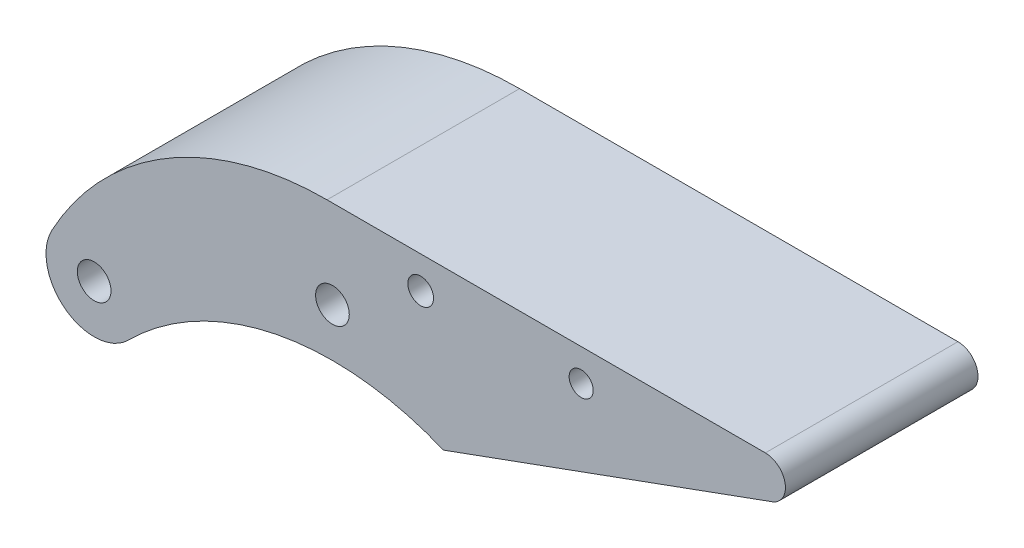
ISO-10303-21;
HEADER;
FILE_DESCRIPTION(('STEP AP214'),'2;1');
FILE_NAME('part.step','',(''),(''),'','','');
FILE_SCHEMA(('AUTOMOTIVE_DESIGN { 1 0 10303 214 1 1 1 1 }'));
ENDSEC;
DATA;
#1=APPLICATION_CONTEXT('core data for automotive mechanical design processes');
#2=APPLICATION_PROTOCOL_DEFINITION('international standard','automotive_design',2000,#1);
#3=PRODUCT_CONTEXT('',#1,'mechanical');
#4=PRODUCT('Part','Part','',(#3));
#5=PRODUCT_RELATED_PRODUCT_CATEGORY('part','',(#4));
#6=PRODUCT_DEFINITION_FORMATION('','',#4);
#7=PRODUCT_DEFINITION_CONTEXT('part definition',#1,'design');
#8=PRODUCT_DEFINITION('design','',#6,#7);
#9=PRODUCT_DEFINITION_SHAPE('','',#8);
#10=(LENGTH_UNIT() NAMED_UNIT(*) SI_UNIT(.MILLI.,.METRE.));
#11=(NAMED_UNIT(*) PLANE_ANGLE_UNIT() SI_UNIT($,.RADIAN.));
#12=(NAMED_UNIT(*) SI_UNIT($,.STERADIAN.) SOLID_ANGLE_UNIT());
#13=UNCERTAINTY_MEASURE_WITH_UNIT(LENGTH_MEASURE(1.E-05),#10,'distance_accuracy_value','');
#14=(GEOMETRIC_REPRESENTATION_CONTEXT(3) GLOBAL_UNCERTAINTY_ASSIGNED_CONTEXT((#13)) GLOBAL_UNIT_ASSIGNED_CONTEXT((#10,
#11,#12)) REPRESENTATION_CONTEXT('',''));
#15=CARTESIAN_POINT('',(0.,0.,0.));
#16=DIRECTION('',(0.,0.,1.));
#17=DIRECTION('',(1.,0.,0.));
#18=AXIS2_PLACEMENT_3D('',#15,#16,#17);
#19=CARTESIAN_POINT('',(0.,53.,24.));
#20=DIRECTION('',(0.,1.,0.));
#21=DIRECTION('',(-1.,0.,0.));
#22=AXIS2_PLACEMENT_3D('',#19,#20,#21);
#23=PLANE('',#22);
#24=DIRECTION('',(1.,0.,0.));
#25=VECTOR('',#24,1.);
#26=CARTESIAN_POINT('',(0.,53.,24.));
#27=LINE('',#26,#25);
#28=CARTESIAN_POINT('',(-0.671642496634896,53.,24.));
#29=VERTEX_POINT('',#28);
#30=CARTESIAN_POINT('',(53.9572820777301,53.,24.));
#31=VERTEX_POINT('',#30);
#32=EDGE_CURVE('E98',#29,#31,#27,.T.);
#33=ORIENTED_EDGE('',*,*,#32,.T.);
#34=DIRECTION('',(0.,0.,-1.));
#35=VECTOR('',#34,1.);
#36=CARTESIAN_POINT('',(53.9572820777301,53.,0.));
#37=LINE('',#36,#35);
#38=CARTESIAN_POINT('',(53.9572820777301,53.,0.));
#39=VERTEX_POINT('',#38);
#40=EDGE_CURVE('E103',#31,#39,#37,.T.);
#41=ORIENTED_EDGE('',*,*,#40,.T.);
#42=DIRECTION('',(1.,0.,0.));
#43=VECTOR('',#42,1.);
#44=CARTESIAN_POINT('',(0.,53.,0.));
#45=LINE('',#44,#43);
#46=CARTESIAN_POINT('',(-0.671642496634896,53.,0.));
#47=VERTEX_POINT('',#46);
#48=EDGE_CURVE('E100',#47,#39,#45,.T.);
#49=ORIENTED_EDGE('',*,*,#48,.F.);
#50=DIRECTION('',(0.,0.,-1.));
#51=VECTOR('',#50,1.);
#52=CARTESIAN_POINT('',(-0.671642496634896,53.,24.));
#53=LINE('',#52,#51);
#54=EDGE_CURVE('E94',#29,#47,#53,.T.);
#55=ORIENTED_EDGE('',*,*,#54,.F.);
#56=EDGE_LOOP('',(#33,#41,#49,#55));
#57=FACE_BOUND('',#56,.T.);
#58=ADVANCED_FACE('F41',(#57),#23,.T.);
#59=CARTESIAN_POINT('',(-0.671642496634893,14.,24.));
#60=DIRECTION('',(0.,0.,-1.));
#61=DIRECTION('',(-1.,0.,0.));
#62=AXIS2_PLACEMENT_3D('',#59,#60,#61);
#63=CYLINDRICAL_SURFACE('',#62,39.);
#64=CARTESIAN_POINT('',(-0.671642496634893,14.,0.));
#65=DIRECTION('',(0.,0.,1.));
#66=DIRECTION('',(1.,0.,0.));
#67=AXIS2_PLACEMENT_3D('',#64,#65,#66);
#68=CIRCLE('',#67,39.);
#69=CARTESIAN_POINT('',(-34.9760925031439,32.5527547752597,0.));
#70=VERTEX_POINT('',#69);
#71=EDGE_CURVE('E140',#47,#70,#68,.T.);
#72=ORIENTED_EDGE('',*,*,#71,.T.);
#73=DIRECTION('',(0.,0.,-1.));
#74=VECTOR('',#73,1.);
#75=CARTESIAN_POINT('',(-34.9760925031439,32.5527547752597,24.));
#76=LINE('',#75,#74);
#77=CARTESIAN_POINT('',(-34.9760925031439,32.5527547752597,24.));
#78=VERTEX_POINT('',#77);
#79=EDGE_CURVE('E104',#78,#70,#76,.T.);
#80=ORIENTED_EDGE('',*,*,#79,.F.);
#81=CARTESIAN_POINT('',(-0.671642496634893,14.,24.));
#82=DIRECTION('',(0.,0.,1.));
#83=DIRECTION('',(1.,0.,0.));
#84=AXIS2_PLACEMENT_3D('',#81,#82,#83);
#85=CIRCLE('',#84,39.);
#86=EDGE_CURVE('E107',#29,#78,#85,.T.);
#87=ORIENTED_EDGE('',*,*,#86,.F.);
#88=ORIENTED_EDGE('',*,*,#54,.T.);
#89=EDGE_LOOP('',(#72,#80,#87,#88));
#90=FACE_BOUND('',#89,.T.);
#91=ADVANCED_FACE('F108',(#90),#63,.T.);
#92=CARTESIAN_POINT('',(-29.6984848098348,29.6984848098351,24.));
#93=DIRECTION('',(0.,0.,-1.));
#94=DIRECTION('',(-1.,0.,0.));
#95=AXIS2_PLACEMENT_3D('',#92,#93,#94);
#96=CYLINDRICAL_SURFACE('',#95,6.00000000000001);
#97=CARTESIAN_POINT('',(-29.6984848098348,29.6984848098351,0.));
#98=DIRECTION('',(0.,0.,1.));
#99=DIRECTION('',(1.,0.,0.));
#100=AXIS2_PLACEMENT_3D('',#97,#98,#99);
#101=CIRCLE('',#100,6.00000000000001);
#102=CARTESIAN_POINT('',(-25.4558441227156,25.4558441227158,0.));
#103=VERTEX_POINT('',#102);
#104=EDGE_CURVE('E142',#70,#103,#101,.T.);
#105=ORIENTED_EDGE('',*,*,#104,.T.);
#106=DIRECTION('',(0.,0.,-1.));
#107=VECTOR('',#106,1.);
#108=CARTESIAN_POINT('',(-25.4558441227156,25.4558441227158,24.));
#109=LINE('',#108,#107);
#110=CARTESIAN_POINT('',(-25.4558441227156,25.4558441227158,24.));
#111=VERTEX_POINT('',#110);
#112=EDGE_CURVE('E153',#111,#103,#109,.T.);
#113=ORIENTED_EDGE('',*,*,#112,.F.);
#114=CARTESIAN_POINT('',(-29.6984848098348,29.6984848098351,24.));
#115=DIRECTION('',(0.,0.,1.));
#116=DIRECTION('',(1.,0.,0.));
#117=AXIS2_PLACEMENT_3D('',#114,#115,#116);
#118=CIRCLE('',#117,6.00000000000001);
#119=EDGE_CURVE('E112',#78,#111,#118,.T.);
#120=ORIENTED_EDGE('',*,*,#119,.F.);
#121=ORIENTED_EDGE('',*,*,#79,.T.);
#122=EDGE_LOOP('',(#105,#113,#120,#121));
#123=FACE_BOUND('',#122,.T.);
#124=ADVANCED_FACE('F162',(#123),#96,.T.);
#125=CARTESIAN_POINT('',(0.,0.,24.));
#126=DIRECTION('',(0.,0.,-1.));
#127=DIRECTION('',(-1.,0.,0.));
#128=AXIS2_PLACEMENT_3D('',#125,#126,#127);
#129=CYLINDRICAL_SURFACE('',#128,36.);
#130=CARTESIAN_POINT('',(0.,0.,0.));
#131=DIRECTION('',(0.,0.,1.));
#132=DIRECTION('',(1.,0.,0.));
#133=AXIS2_PLACEMENT_3D('',#130,#131,#132);
#134=CIRCLE('',#133,36.);
#135=CARTESIAN_POINT('',(13.833943007207,33.2358544477699,0.));
#136=VERTEX_POINT('',#135);
#137=EDGE_CURVE('E145',#136,#103,#134,.T.);
#138=ORIENTED_EDGE('',*,*,#137,.F.);
#139=DIRECTION('',(0.,0.,-1.));
#140=VECTOR('',#139,1.);
#141=CARTESIAN_POINT('',(13.833943007207,33.2358544477699,24.));
#142=LINE('',#141,#140);
#143=CARTESIAN_POINT('',(13.833943007207,33.2358544477699,24.));
#144=VERTEX_POINT('',#143);
#145=EDGE_CURVE('E138',#144,#136,#142,.T.);
#146=ORIENTED_EDGE('',*,*,#145,.F.);
#147=CARTESIAN_POINT('',(0.,0.,24.));
#148=DIRECTION('',(0.,0.,1.));
#149=DIRECTION('',(1.,0.,0.));
#150=AXIS2_PLACEMENT_3D('',#147,#148,#149);
#151=CIRCLE('',#150,36.);
#152=EDGE_CURVE('E127',#144,#111,#151,.T.);
#153=ORIENTED_EDGE('',*,*,#152,.T.);
#154=ORIENTED_EDGE('',*,*,#112,.T.);
#155=EDGE_LOOP('',(#138,#146,#153,#154));
#156=FACE_BOUND('',#155,.T.);
#157=ADVANCED_FACE('F167',(#156),#129,.F.);
#158=CARTESIAN_POINT('',(0.,42.,24.));
#159=DIRECTION('',(0.,0.,-1.));
#160=DIRECTION('',(-1.,0.,0.));
#161=AXIS2_PLACEMENT_3D('',#158,#159,#160);
#162=CYLINDRICAL_SURFACE('',#161,2.1);
#163=CARTESIAN_POINT('',(0.,42.,24.));
#164=DIRECTION('',(0.,0.,1.));
#165=DIRECTION('',(1.,0.,0.));
#166=AXIS2_PLACEMENT_3D('',#163,#164,#165);
#167=CIRCLE('',#166,2.1);
#168=CARTESIAN_POINT('',(2.1,42.,24.));
#169=VERTEX_POINT('',#168);
#170=EDGE_CURVE('E132',#169,#169,#167,.T.);
#171=ORIENTED_EDGE('',*,*,#170,.T.);
#172=EDGE_LOOP('',(#171));
#173=FACE_BOUND('',#172,.T.);
#174=CARTESIAN_POINT('',(0.,42.,0.));
#175=DIRECTION('',(0.,0.,1.));
#176=DIRECTION('',(1.,0.,0.));
#177=AXIS2_PLACEMENT_3D('',#174,#175,#176);
#178=CIRCLE('',#177,2.1);
#179=CARTESIAN_POINT('',(2.1,42.,0.));
#180=VERTEX_POINT('',#179);
#181=EDGE_CURVE('E120',#180,#180,#178,.T.);
#182=ORIENTED_EDGE('',*,*,#181,.F.);
#183=EDGE_LOOP('',(#182));
#184=FACE_BOUND('',#183,.T.);
#185=ADVANCED_FACE('F171',(#173,#184),#162,.F.);
#186=CARTESIAN_POINT('',(-9.06353379813008,24.9018544508266,24.));
#187=DIRECTION('',(-0.342020143325663,0.93969262078591,0.));
#188=DIRECTION('',(-0.93969262078591,-0.342020143325663,0.));
#189=AXIS2_PLACEMENT_3D('',#186,#187,#188);
#190=PLANE('',#189);
#191=DIRECTION('',(0.939692620785911,0.342020143325663,0.));
#192=VECTOR('',#191,1.);
#193=CARTESIAN_POINT('',(-9.06353379813008,24.9018544508266,0.));
#194=LINE('',#193,#192);
#195=CARTESIAN_POINT('',(54.8123324360443,48.1507684480352,0.));
#196=VERTEX_POINT('',#195);
#197=EDGE_CURVE('E148',#136,#196,#194,.T.);
#198=ORIENTED_EDGE('',*,*,#197,.T.);
#199=DIRECTION('',(0.,0.,-1.));
#200=VECTOR('',#199,1.);
#201=CARTESIAN_POINT('',(54.8123324360442,48.1507684480352,24.));
#202=LINE('',#201,#200);
#203=CARTESIAN_POINT('',(54.8123324360443,48.1507684480352,24.));
#204=VERTEX_POINT('',#203);
#205=EDGE_CURVE('E49',#196,#204,#202,.F.);
#206=ORIENTED_EDGE('',*,*,#205,.T.);
#207=DIRECTION('',(0.939692620785911,0.342020143325663,0.));
#208=VECTOR('',#207,1.);
#209=CARTESIAN_POINT('',(-9.06353379813008,24.9018544508266,24.));
#210=LINE('',#209,#208);
#211=EDGE_CURVE('E130',#144,#204,#210,.T.);
#212=ORIENTED_EDGE('',*,*,#211,.F.);
#213=ORIENTED_EDGE('',*,*,#145,.T.);
#214=EDGE_LOOP('',(#198,#206,#212,#213));
#215=FACE_BOUND('',#214,.T.);
#216=ADVANCED_FACE('F168',(#215),#190,.F.);
#217=CARTESIAN_POINT('',(-29.6984848098348,29.6984848098351,24.));
#218=DIRECTION('',(0.,0.,-1.));
#219=DIRECTION('',(-1.,0.,0.));
#220=AXIS2_PLACEMENT_3D('',#217,#218,#219);
#221=CYLINDRICAL_SURFACE('',#220,2.1);
#222=CARTESIAN_POINT('',(-29.6984848098348,29.6984848098351,24.));
#223=DIRECTION('',(0.,0.,1.));
#224=DIRECTION('',(1.,0.,0.));
#225=AXIS2_PLACEMENT_3D('',#222,#223,#224);
#226=CIRCLE('',#225,2.1);
#227=CARTESIAN_POINT('',(-27.5984848098348,29.6984848098351,24.));
#228=VERTEX_POINT('',#227);
#229=EDGE_CURVE('E135',#228,#228,#226,.T.);
#230=ORIENTED_EDGE('',*,*,#229,.T.);
#231=EDGE_LOOP('',(#230));
#232=FACE_BOUND('',#231,.T.);
#233=CARTESIAN_POINT('',(-29.6984848098348,29.6984848098351,0.));
#234=DIRECTION('',(0.,0.,1.));
#235=DIRECTION('',(1.,0.,0.));
#236=AXIS2_PLACEMENT_3D('',#233,#234,#235);
#237=CIRCLE('',#236,2.1);
#238=CARTESIAN_POINT('',(-27.5984848098348,29.6984848098351,0.));
#239=VERTEX_POINT('',#238);
#240=EDGE_CURVE('E117',#239,#239,#237,.T.);
#241=ORIENTED_EDGE('',*,*,#240,.F.);
#242=EDGE_LOOP('',(#241));
#243=FACE_BOUND('',#242,.T.);
#244=ADVANCED_FACE('F170',(#232,#243),#221,.F.);
#245=CARTESIAN_POINT('',(0.,0.,24.));
#246=DIRECTION('',(0.,0.,1.));
#247=DIRECTION('',(1.,0.,0.));
#248=AXIS2_PLACEMENT_3D('',#245,#246,#247);
#249=PLANE('',#248);
#250=CARTESIAN_POINT('',(31.,49.,24.));
#251=DIRECTION('',(0.,0.,1.));
#252=DIRECTION('',(1.,0.,0.));
#253=AXIS2_PLACEMENT_3D('',#250,#251,#252);
#254=CIRCLE('',#253,1.5);
#255=CARTESIAN_POINT('',(32.5,49.,24.));
#256=VERTEX_POINT('',#255);
#257=EDGE_CURVE('E256',#256,#256,#254,.T.);
#258=ORIENTED_EDGE('',*,*,#257,.F.);
#259=EDGE_LOOP('',(#258));
#260=FACE_BOUND('',#259,.T.);
#261=CARTESIAN_POINT('',(11.,49.,24.));
#262=DIRECTION('',(0.,0.,1.));
#263=DIRECTION('',(1.,0.,0.));
#264=AXIS2_PLACEMENT_3D('',#261,#262,#263);
#265=CIRCLE('',#264,1.6);
#266=CARTESIAN_POINT('',(12.6,49.,24.));
#267=VERTEX_POINT('',#266);
#268=EDGE_CURVE('E260',#267,#267,#265,.T.);
#269=ORIENTED_EDGE('',*,*,#268,.F.);
#270=EDGE_LOOP('',(#269));
#271=FACE_BOUND('',#270,.T.);
#272=ORIENTED_EDGE('',*,*,#211,.T.);
#273=CARTESIAN_POINT('',(53.9572820777301,50.5,24.));
#274=DIRECTION('',(0.,0.,1.));
#275=DIRECTION('',(1.,0.,0.));
#276=AXIS2_PLACEMENT_3D('',#273,#274,#275);
#277=CIRCLE('',#276,2.5);
#278=EDGE_CURVE('E11',#204,#31,#277,.T.);
#279=ORIENTED_EDGE('',*,*,#278,.T.);
#280=ORIENTED_EDGE('',*,*,#32,.F.);
#281=ORIENTED_EDGE('',*,*,#86,.T.);
#282=ORIENTED_EDGE('',*,*,#119,.T.);
#283=ORIENTED_EDGE('',*,*,#152,.F.);
#284=EDGE_LOOP('',(#272,#279,#280,#281,#282,#283));
#285=FACE_BOUND('',#284,.T.);
#286=ORIENTED_EDGE('',*,*,#170,.F.);
#287=EDGE_LOOP('',(#286));
#288=FACE_BOUND('',#287,.T.);
#289=ORIENTED_EDGE('',*,*,#229,.F.);
#290=EDGE_LOOP('',(#289));
#291=FACE_BOUND('',#290,.T.);
#292=ADVANCED_FACE('F114',(#260,#271,#285,#288,#291),#249,.T.);
#293=CARTESIAN_POINT('',(0.,0.,0.));
#294=DIRECTION('',(0.,0.,1.));
#295=DIRECTION('',(1.,0.,0.));
#296=AXIS2_PLACEMENT_3D('',#293,#294,#295);
#297=PLANE('',#296);
#298=CARTESIAN_POINT('',(31.,49.,0.));
#299=DIRECTION('',(0.,0.,1.));
#300=DIRECTION('',(1.,0.,0.));
#301=AXIS2_PLACEMENT_3D('',#298,#299,#300);
#302=CIRCLE('',#301,1.5);
#303=CARTESIAN_POINT('',(32.5,49.,0.));
#304=VERTEX_POINT('',#303);
#305=EDGE_CURVE('E259',#304,#304,#302,.F.);
#306=ORIENTED_EDGE('',*,*,#305,.F.);
#307=EDGE_LOOP('',(#306));
#308=FACE_BOUND('',#307,.T.);
#309=CARTESIAN_POINT('',(11.,49.,0.));
#310=DIRECTION('',(0.,0.,1.));
#311=DIRECTION('',(1.,0.,0.));
#312=AXIS2_PLACEMENT_3D('',#309,#310,#311);
#313=CIRCLE('',#312,1.6);
#314=CARTESIAN_POINT('',(12.6,49.,0.));
#315=VERTEX_POINT('',#314);
#316=EDGE_CURVE('E123',#315,#315,#313,.F.);
#317=ORIENTED_EDGE('',*,*,#316,.F.);
#318=EDGE_LOOP('',(#317));
#319=FACE_BOUND('',#318,.T.);
#320=ORIENTED_EDGE('',*,*,#48,.T.);
#321=CARTESIAN_POINT('',(53.9572820777301,50.5,0.));
#322=DIRECTION('',(0.,0.,1.));
#323=DIRECTION('',(1.,0.,0.));
#324=AXIS2_PLACEMENT_3D('',#321,#322,#323);
#325=CIRCLE('',#324,2.5);
#326=EDGE_CURVE('E63',#39,#196,#325,.F.);
#327=ORIENTED_EDGE('',*,*,#326,.T.);
#328=ORIENTED_EDGE('',*,*,#197,.F.);
#329=ORIENTED_EDGE('',*,*,#137,.T.);
#330=ORIENTED_EDGE('',*,*,#104,.F.);
#331=ORIENTED_EDGE('',*,*,#71,.F.);
#332=EDGE_LOOP('',(#320,#327,#328,#329,#330,#331));
#333=FACE_BOUND('',#332,.T.);
#334=ORIENTED_EDGE('',*,*,#181,.T.);
#335=EDGE_LOOP('',(#334));
#336=FACE_BOUND('',#335,.T.);
#337=ORIENTED_EDGE('',*,*,#240,.T.);
#338=EDGE_LOOP('',(#337));
#339=FACE_BOUND('',#338,.T.);
#340=ADVANCED_FACE('F158',(#308,#319,#333,#336,#339),#297,.F.);
#341=CARTESIAN_POINT('',(53.9572820777301,50.5,24.));
#342=DIRECTION('',(0.,0.,1.));
#343=DIRECTION('',(1.,0.,0.));
#344=AXIS2_PLACEMENT_3D('',#341,#342,#343);
#345=CYLINDRICAL_SURFACE('',#344,2.5);
#346=ORIENTED_EDGE('',*,*,#278,.F.);
#347=ORIENTED_EDGE('',*,*,#205,.F.);
#348=ORIENTED_EDGE('',*,*,#326,.F.);
#349=ORIENTED_EDGE('',*,*,#40,.F.);
#350=EDGE_LOOP('',(#346,#347,#348,#349));
#351=FACE_BOUND('',#350,.T.);
#352=ADVANCED_FACE('F43',(#351),#345,.T.);
#353=CARTESIAN_POINT('',(11.,49.,-0.001000000000001));
#354=DIRECTION('',(0.,0.,1.));
#355=DIRECTION('',(1.,0.,0.));
#356=AXIS2_PLACEMENT_3D('',#353,#354,#355);
#357=CYLINDRICAL_SURFACE('',#356,1.6);
#358=CARTESIAN_POINT('',(12.6,49.,24.));
#359=CARTESIAN_POINT('',(12.6,49.,23.75));
#360=CARTESIAN_POINT('',(12.6,49.,23.5));
#361=CARTESIAN_POINT('',(12.6,49.,23.));
#362=CARTESIAN_POINT('',(12.6,49.,22.75));
#363=CARTESIAN_POINT('',(12.6,49.,22.25));
#364=CARTESIAN_POINT('',(12.6,49.,22.));
#365=CARTESIAN_POINT('',(12.6,49.,21.5));
#366=CARTESIAN_POINT('',(12.6,49.,21.25));
#367=CARTESIAN_POINT('',(12.6,49.,20.75));
#368=CARTESIAN_POINT('',(12.6,49.,20.5));
#369=CARTESIAN_POINT('',(12.6,49.,20.));
#370=CARTESIAN_POINT('',(12.6,49.,19.75));
#371=CARTESIAN_POINT('',(12.6,49.,19.25));
#372=CARTESIAN_POINT('',(12.6,49.,19.));
#373=CARTESIAN_POINT('',(12.6,49.,18.5));
#374=CARTESIAN_POINT('',(12.6,49.,18.25));
#375=CARTESIAN_POINT('',(12.6,49.,17.75));
#376=CARTESIAN_POINT('',(12.6,49.,17.5));
#377=CARTESIAN_POINT('',(12.6,49.,17.));
#378=CARTESIAN_POINT('',(12.6,49.,16.75));
#379=CARTESIAN_POINT('',(12.6,49.,16.25));
#380=CARTESIAN_POINT('',(12.6,49.,16.));
#381=CARTESIAN_POINT('',(12.6,49.,15.5));
#382=CARTESIAN_POINT('',(12.6,49.,15.25));
#383=CARTESIAN_POINT('',(12.6,49.,14.75));
#384=CARTESIAN_POINT('',(12.6,49.,14.5));
#385=CARTESIAN_POINT('',(12.6,49.,14.));
#386=CARTESIAN_POINT('',(12.6,49.,13.75));
#387=CARTESIAN_POINT('',(12.6,49.,13.25));
#388=CARTESIAN_POINT('',(12.6,49.,13.));
#389=CARTESIAN_POINT('',(12.6,49.,12.5));
#390=CARTESIAN_POINT('',(12.6,49.,12.25));
#391=CARTESIAN_POINT('',(12.6,49.,11.75));
#392=CARTESIAN_POINT('',(12.6,49.,11.5));
#393=CARTESIAN_POINT('',(12.6,49.,11.));
#394=CARTESIAN_POINT('',(12.6,49.,10.75));
#395=CARTESIAN_POINT('',(12.6,49.,10.25));
#396=CARTESIAN_POINT('',(12.6,49.,10.));
#397=CARTESIAN_POINT('',(12.6,49.,9.5));
#398=CARTESIAN_POINT('',(12.6,49.,9.25));
#399=CARTESIAN_POINT('',(12.6,49.,8.75));
#400=CARTESIAN_POINT('',(12.6,49.,8.5));
#401=CARTESIAN_POINT('',(12.6,49.,8.));
#402=CARTESIAN_POINT('',(12.6,49.,7.75));
#403=CARTESIAN_POINT('',(12.6,49.,7.25));
#404=CARTESIAN_POINT('',(12.6,49.,7.));
#405=CARTESIAN_POINT('',(12.6,49.,6.5));
#406=CARTESIAN_POINT('',(12.6,49.,6.25));
#407=CARTESIAN_POINT('',(12.6,49.,5.75));
#408=CARTESIAN_POINT('',(12.6,49.,5.5));
#409=CARTESIAN_POINT('',(12.6,49.,5.));
#410=CARTESIAN_POINT('',(12.6,49.,4.75));
#411=CARTESIAN_POINT('',(12.6,49.,4.25));
#412=CARTESIAN_POINT('',(12.6,49.,4.));
#413=CARTESIAN_POINT('',(12.6,49.,3.5));
#414=CARTESIAN_POINT('',(12.6,49.,3.25));
#415=CARTESIAN_POINT('',(12.6,49.,2.75));
#416=CARTESIAN_POINT('',(12.6,49.,2.5));
#417=CARTESIAN_POINT('',(12.6,49.,2.));
#418=CARTESIAN_POINT('',(12.6,49.,1.75));
#419=CARTESIAN_POINT('',(12.6,49.,1.25));
#420=CARTESIAN_POINT('',(12.6,49.,1.));
#421=CARTESIAN_POINT('',(12.6,49.,0.5));
#422=CARTESIAN_POINT('',(12.6,49.,0.25));
#423=CARTESIAN_POINT('',(12.6,49.,0.));
#424=B_SPLINE_CURVE_WITH_KNOTS('',3,(#358,#359,#360,#361,#362,#363,#364,#365,#366,#367,#368,
#369,#370,#371,#372,#373,#374,#375,#376,#377,#378,#379,#380,#381,#382,#383,#384,#385,#386,#387,
#388,#389,#390,#391,#392,#393,#394,#395,#396,#397,#398,#399,#400,#401,#402,#403,#404,#405,#406,
#407,#408,#409,#410,#411,#412,#413,#414,#415,#416,#417,#418,#419,#420,#421,#422,#423),
.UNSPECIFIED.,.F.,.F.,(4,2,2,2,2,2,2,2,2,2,2,2,2,2,2,2,2,2,2,2,2,2,2,2,2,2,2,2,2,2,2,2,4),(0.,
0.750000000000001,1.5,2.25,3.,3.75,4.5,5.25,6.,6.75,7.5,8.25,9.,9.75,10.5,11.25,12.,12.75,13.5,
14.25,15.,15.75,16.5,17.25,18.,18.75,19.5,20.25,21.,21.75,22.5,23.25,24.),.UNSPECIFIED.);
#425=EDGE_CURVE('BSEAM238',#267,#315,#424,.T.);
#426=ORIENTED_EDGE('',*,*,#268,.T.);
#427=ORIENTED_EDGE('',*,*,#316,.T.);
#428=ORIENTED_EDGE('',*,*,#425,.T.);
#429=ORIENTED_EDGE('',*,*,#425,.F.);
#430=EDGE_LOOP('',(#426,#428,#427,#429));
#431=FACE_BOUND('',#430,.T.);
#432=ADVANCED_FACE('F238',(#431),#357,.F.);
#433=CARTESIAN_POINT('',(31.,49.,-0.001000000000001));
#434=DIRECTION('',(0.,0.,1.));
#435=DIRECTION('',(1.,0.,0.));
#436=AXIS2_PLACEMENT_3D('',#433,#434,#435);
#437=CYLINDRICAL_SURFACE('',#436,1.5);
#438=CARTESIAN_POINT('',(32.5,49.,24.));
#439=CARTESIAN_POINT('',(32.5,49.,23.75));
#440=CARTESIAN_POINT('',(32.5,49.,23.5));
#441=CARTESIAN_POINT('',(32.5,49.,23.));
#442=CARTESIAN_POINT('',(32.5,49.,22.75));
#443=CARTESIAN_POINT('',(32.5,49.,22.25));
#444=CARTESIAN_POINT('',(32.5,49.,22.));
#445=CARTESIAN_POINT('',(32.5,49.,21.5));
#446=CARTESIAN_POINT('',(32.5,49.,21.25));
#447=CARTESIAN_POINT('',(32.5,49.,20.75));
#448=CARTESIAN_POINT('',(32.5,49.,20.5));
#449=CARTESIAN_POINT('',(32.5,49.,20.));
#450=CARTESIAN_POINT('',(32.5,49.,19.75));
#451=CARTESIAN_POINT('',(32.5,49.,19.25));
#452=CARTESIAN_POINT('',(32.5,49.,19.));
#453=CARTESIAN_POINT('',(32.5,49.,18.5));
#454=CARTESIAN_POINT('',(32.5,49.,18.25));
#455=CARTESIAN_POINT('',(32.5,49.,17.75));
#456=CARTESIAN_POINT('',(32.5,49.,17.5));
#457=CARTESIAN_POINT('',(32.5,49.,17.));
#458=CARTESIAN_POINT('',(32.5,49.,16.75));
#459=CARTESIAN_POINT('',(32.5,49.,16.25));
#460=CARTESIAN_POINT('',(32.5,49.,16.));
#461=CARTESIAN_POINT('',(32.5,49.,15.5));
#462=CARTESIAN_POINT('',(32.5,49.,15.25));
#463=CARTESIAN_POINT('',(32.5,49.,14.75));
#464=CARTESIAN_POINT('',(32.5,49.,14.5));
#465=CARTESIAN_POINT('',(32.5,49.,14.));
#466=CARTESIAN_POINT('',(32.5,49.,13.75));
#467=CARTESIAN_POINT('',(32.5,49.,13.25));
#468=CARTESIAN_POINT('',(32.5,49.,13.));
#469=CARTESIAN_POINT('',(32.5,49.,12.5));
#470=CARTESIAN_POINT('',(32.5,49.,12.25));
#471=CARTESIAN_POINT('',(32.5,49.,11.75));
#472=CARTESIAN_POINT('',(32.5,49.,11.5));
#473=CARTESIAN_POINT('',(32.5,49.,11.));
#474=CARTESIAN_POINT('',(32.5,49.,10.75));
#475=CARTESIAN_POINT('',(32.5,49.,10.25));
#476=CARTESIAN_POINT('',(32.5,49.,10.));
#477=CARTESIAN_POINT('',(32.5,49.,9.5));
#478=CARTESIAN_POINT('',(32.5,49.,9.25));
#479=CARTESIAN_POINT('',(32.5,49.,8.75));
#480=CARTESIAN_POINT('',(32.5,49.,8.5));
#481=CARTESIAN_POINT('',(32.5,49.,8.));
#482=CARTESIAN_POINT('',(32.5,49.,7.75));
#483=CARTESIAN_POINT('',(32.5,49.,7.25));
#484=CARTESIAN_POINT('',(32.5,49.,7.));
#485=CARTESIAN_POINT('',(32.5,49.,6.5));
#486=CARTESIAN_POINT('',(32.5,49.,6.25));
#487=CARTESIAN_POINT('',(32.5,49.,5.75));
#488=CARTESIAN_POINT('',(32.5,49.,5.5));
#489=CARTESIAN_POINT('',(32.5,49.,5.));
#490=CARTESIAN_POINT('',(32.5,49.,4.75));
#491=CARTESIAN_POINT('',(32.5,49.,4.25));
#492=CARTESIAN_POINT('',(32.5,49.,4.));
#493=CARTESIAN_POINT('',(32.5,49.,3.5));
#494=CARTESIAN_POINT('',(32.5,49.,3.25));
#495=CARTESIAN_POINT('',(32.5,49.,2.75));
#496=CARTESIAN_POINT('',(32.5,49.,2.5));
#497=CARTESIAN_POINT('',(32.5,49.,2.));
#498=CARTESIAN_POINT('',(32.5,49.,1.75));
#499=CARTESIAN_POINT('',(32.5,49.,1.25));
#500=CARTESIAN_POINT('',(32.5,49.,1.));
#501=CARTESIAN_POINT('',(32.5,49.,0.5));
#502=CARTESIAN_POINT('',(32.5,49.,0.25));
#503=CARTESIAN_POINT('',(32.5,49.,0.));
#504=B_SPLINE_CURVE_WITH_KNOTS('',3,(#438,#439,#440,#441,#442,#443,#444,#445,#446,#447,#448,
#449,#450,#451,#452,#453,#454,#455,#456,#457,#458,#459,#460,#461,#462,#463,#464,#465,#466,#467,
#468,#469,#470,#471,#472,#473,#474,#475,#476,#477,#478,#479,#480,#481,#482,#483,#484,#485,#486,
#487,#488,#489,#490,#491,#492,#493,#494,#495,#496,#497,#498,#499,#500,#501,#502,#503),
.UNSPECIFIED.,.F.,.F.,(4,2,2,2,2,2,2,2,2,2,2,2,2,2,2,2,2,2,2,2,2,2,2,2,2,2,2,2,2,2,2,2,4),(0.,
0.750000000000001,1.5,2.25,3.,3.75,4.5,5.25,6.,6.75,7.5,8.25,9.,9.75,10.5,11.25,12.,12.75,13.5,
14.25,15.,15.75,16.5,17.25,18.,18.75,19.5,20.25,21.,21.75,22.5,23.25,24.),.UNSPECIFIED.);
#505=EDGE_CURVE('BSEAM243',#256,#304,#504,.T.);
#506=ORIENTED_EDGE('',*,*,#257,.T.);
#507=ORIENTED_EDGE('',*,*,#305,.T.);
#508=ORIENTED_EDGE('',*,*,#505,.T.);
#509=ORIENTED_EDGE('',*,*,#505,.F.);
#510=EDGE_LOOP('',(#506,#508,#507,#509));
#511=FACE_BOUND('',#510,.T.);
#512=ADVANCED_FACE('F243',(#511),#437,.F.);
#513=CLOSED_SHELL('',(#58,#91,#124,#157,#185,#216,#244,#292,#340,#352,#432,#512));
#514=MANIFOLD_SOLID_BREP('B2',#513);
#515=ADVANCED_BREP_SHAPE_REPRESENTATION('',(#18,#514),#14);
#516=SHAPE_DEFINITION_REPRESENTATION(#9,#515);
ENDSEC;
END-ISO-10303-21;
